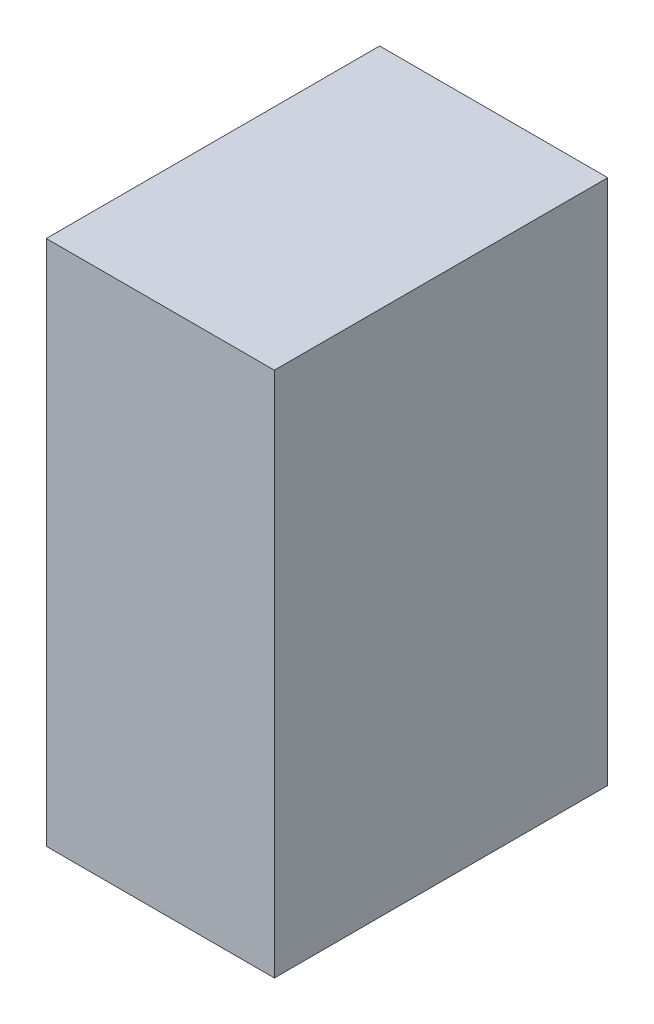
ISO-10303-21;
HEADER;
FILE_DESCRIPTION(('STEP AP214'),'2;1');
FILE_NAME('part.step','',(''),(''),'','','');
FILE_SCHEMA(('AUTOMOTIVE_DESIGN { 1 0 10303 214 1 1 1 1 }'));
ENDSEC;
DATA;
#1=APPLICATION_CONTEXT('core data for automotive mechanical design processes');
#2=APPLICATION_PROTOCOL_DEFINITION('international standard','automotive_design',2000,#1);
#3=PRODUCT_CONTEXT('',#1,'mechanical');
#4=PRODUCT('Part','Part','',(#3));
#5=PRODUCT_RELATED_PRODUCT_CATEGORY('part','',(#4));
#6=PRODUCT_DEFINITION_FORMATION('','',#4);
#7=PRODUCT_DEFINITION_CONTEXT('part definition',#1,'design');
#8=PRODUCT_DEFINITION('design','',#6,#7);
#9=PRODUCT_DEFINITION_SHAPE('','',#8);
#10=(LENGTH_UNIT() NAMED_UNIT(*) SI_UNIT(.MILLI.,.METRE.));
#11=(NAMED_UNIT(*) PLANE_ANGLE_UNIT() SI_UNIT($,.RADIAN.));
#12=(NAMED_UNIT(*) SI_UNIT($,.STERADIAN.) SOLID_ANGLE_UNIT());
#13=UNCERTAINTY_MEASURE_WITH_UNIT(LENGTH_MEASURE(1.E-05),#10,'distance_accuracy_value','');
#14=(GEOMETRIC_REPRESENTATION_CONTEXT(3) GLOBAL_UNCERTAINTY_ASSIGNED_CONTEXT((#13)) GLOBAL_UNIT_ASSIGNED_CONTEXT((#10,
#11,#12)) REPRESENTATION_CONTEXT('',''));
#15=CARTESIAN_POINT('',(0.,0.,0.));
#16=DIRECTION('',(0.,0.,1.));
#17=DIRECTION('',(1.,0.,0.));
#18=AXIS2_PLACEMENT_3D('',#15,#16,#17);
#19=CARTESIAN_POINT('',(-32.5,0.,0.));
#20=DIRECTION('',(0.,-1.,0.));
#21=DIRECTION('',(0.,0.,-1.));
#22=AXIS2_PLACEMENT_3D('',#19,#20,#21);
#23=PLANE('',#22);
#24=DIRECTION('',(1.,0.,0.));
#25=VECTOR('',#24,1.);
#26=CARTESIAN_POINT('',(-32.5,0.,0.));
#27=LINE('',#26,#25);
#28=CARTESIAN_POINT('',(-32.5,0.,0.));
#29=VERTEX_POINT('',#28);
#30=CARTESIAN_POINT('',(32.5,0.,0.));
#31=VERTEX_POINT('',#30);
#32=EDGE_CURVE('E48',#29,#31,#27,.T.);
#33=ORIENTED_EDGE('',*,*,#32,.T.);
#34=DIRECTION('',(0.,0.,-1.));
#35=VECTOR('',#34,1.);
#36=CARTESIAN_POINT('',(32.5,0.,0.));
#37=LINE('',#36,#35);
#38=CARTESIAN_POINT('',(32.5,0.,95.));
#39=VERTEX_POINT('',#38);
#40=EDGE_CURVE('E86',#39,#31,#37,.T.);
#41=ORIENTED_EDGE('',*,*,#40,.F.);
#42=DIRECTION('',(1.,0.,0.));
#43=VECTOR('',#42,1.);
#44=CARTESIAN_POINT('',(-32.5,0.,95.));
#45=LINE('',#44,#43);
#46=CARTESIAN_POINT('',(-32.5,0.,95.));
#47=VERTEX_POINT('',#46);
#48=EDGE_CURVE('E11',#47,#39,#45,.T.);
#49=ORIENTED_EDGE('',*,*,#48,.F.);
#50=DIRECTION('',(0.,0.,-1.));
#51=VECTOR('',#50,1.);
#52=CARTESIAN_POINT('',(-32.5,0.,0.));
#53=LINE('',#52,#51);
#54=EDGE_CURVE('E90',#47,#29,#53,.T.);
#55=ORIENTED_EDGE('',*,*,#54,.T.);
#56=EDGE_LOOP('',(#33,#41,#49,#55));
#57=FACE_BOUND('',#56,.T.);
#58=ADVANCED_FACE('F44',(#57),#23,.T.);
#59=CARTESIAN_POINT('',(-32.5,0.,95.));
#60=DIRECTION('',(0.,0.,1.));
#61=DIRECTION('',(0.,-1.,0.));
#62=AXIS2_PLACEMENT_3D('',#59,#60,#61);
#63=PLANE('',#62);
#64=ORIENTED_EDGE('',*,*,#48,.T.);
#65=DIRECTION('',(0.,-1.,0.));
#66=VECTOR('',#65,1.);
#67=CARTESIAN_POINT('',(32.5,0.,95.));
#68=LINE('',#67,#66);
#69=CARTESIAN_POINT('',(32.5,150.,95.));
#70=VERTEX_POINT('',#69);
#71=EDGE_CURVE('E103',#70,#39,#68,.T.);
#72=ORIENTED_EDGE('',*,*,#71,.F.);
#73=DIRECTION('',(1.,0.,0.));
#74=VECTOR('',#73,1.);
#75=CARTESIAN_POINT('',(-32.5,150.,95.));
#76=LINE('',#75,#74);
#77=CARTESIAN_POINT('',(-32.5,150.,95.));
#78=VERTEX_POINT('',#77);
#79=EDGE_CURVE('E53',#78,#70,#76,.T.);
#80=ORIENTED_EDGE('',*,*,#79,.F.);
#81=DIRECTION('',(0.,-1.,0.));
#82=VECTOR('',#81,1.);
#83=CARTESIAN_POINT('',(-32.5,0.,95.));
#84=LINE('',#83,#82);
#85=EDGE_CURVE('E93',#78,#47,#84,.T.);
#86=ORIENTED_EDGE('',*,*,#85,.T.);
#87=EDGE_LOOP('',(#64,#72,#80,#86));
#88=FACE_BOUND('',#87,.T.);
#89=ADVANCED_FACE('F129',(#88),#63,.T.);
#90=CARTESIAN_POINT('',(-32.5,150.,0.));
#91=DIRECTION('',(0.,1.,0.));
#92=DIRECTION('',(0.,0.,1.));
#93=AXIS2_PLACEMENT_3D('',#90,#91,#92);
#94=PLANE('',#93);
#95=ORIENTED_EDGE('',*,*,#79,.T.);
#96=DIRECTION('',(0.,0.,1.));
#97=VECTOR('',#96,1.);
#98=CARTESIAN_POINT('',(32.5,150.,0.));
#99=LINE('',#98,#97);
#100=CARTESIAN_POINT('',(32.5,150.,0.));
#101=VERTEX_POINT('',#100);
#102=EDGE_CURVE('E102',#101,#70,#99,.T.);
#103=ORIENTED_EDGE('',*,*,#102,.F.);
#104=DIRECTION('',(1.,0.,0.));
#105=VECTOR('',#104,1.);
#106=CARTESIAN_POINT('',(-32.5,150.,0.));
#107=LINE('',#106,#105);
#108=CARTESIAN_POINT('',(-32.5,150.,0.));
#109=VERTEX_POINT('',#108);
#110=EDGE_CURVE('E95',#109,#101,#107,.T.);
#111=ORIENTED_EDGE('',*,*,#110,.F.);
#112=DIRECTION('',(0.,0.,1.));
#113=VECTOR('',#112,1.);
#114=CARTESIAN_POINT('',(-32.5,150.,0.));
#115=LINE('',#114,#113);
#116=EDGE_CURVE('E120',#109,#78,#115,.T.);
#117=ORIENTED_EDGE('',*,*,#116,.T.);
#118=EDGE_LOOP('',(#95,#103,#111,#117));
#119=FACE_BOUND('',#118,.T.);
#120=ADVANCED_FACE('F128',(#119),#94,.T.);
#121=CARTESIAN_POINT('',(-32.5,0.,0.));
#122=DIRECTION('',(0.,0.,-1.));
#123=DIRECTION('',(-1.,0.,0.));
#124=AXIS2_PLACEMENT_3D('',#121,#122,#123);
#125=PLANE('',#124);
#126=ORIENTED_EDGE('',*,*,#110,.T.);
#127=DIRECTION('',(0.,1.,0.));
#128=VECTOR('',#127,1.);
#129=CARTESIAN_POINT('',(32.5,0.,0.));
#130=LINE('',#129,#128);
#131=EDGE_CURVE('E94',#31,#101,#130,.T.);
#132=ORIENTED_EDGE('',*,*,#131,.F.);
#133=ORIENTED_EDGE('',*,*,#32,.F.);
#134=DIRECTION('',(0.,1.,0.));
#135=VECTOR('',#134,1.);
#136=CARTESIAN_POINT('',(-32.5,0.,0.));
#137=LINE('',#136,#135);
#138=EDGE_CURVE('E113',#29,#109,#137,.T.);
#139=ORIENTED_EDGE('',*,*,#138,.T.);
#140=EDGE_LOOP('',(#126,#132,#133,#139));
#141=FACE_BOUND('',#140,.T.);
#142=ADVANCED_FACE('F96',(#141),#125,.T.);
#143=CARTESIAN_POINT('',(-32.5,0.,0.));
#144=DIRECTION('',(-1.,0.,0.));
#145=DIRECTION('',(0.,0.,1.));
#146=AXIS2_PLACEMENT_3D('',#143,#144,#145);
#147=PLANE('',#146);
#148=ORIENTED_EDGE('',*,*,#54,.F.);
#149=ORIENTED_EDGE('',*,*,#85,.F.);
#150=ORIENTED_EDGE('',*,*,#116,.F.);
#151=ORIENTED_EDGE('',*,*,#138,.F.);
#152=EDGE_LOOP('',(#148,#149,#150,#151));
#153=FACE_BOUND('',#152,.T.);
#154=ADVANCED_FACE('F131',(#153),#147,.T.);
#155=CARTESIAN_POINT('',(32.5,0.,0.));
#156=DIRECTION('',(1.,0.,0.));
#157=DIRECTION('',(0.,0.,1.));
#158=AXIS2_PLACEMENT_3D('',#155,#156,#157);
#159=PLANE('',#158);
#160=ORIENTED_EDGE('',*,*,#40,.T.);
#161=ORIENTED_EDGE('',*,*,#131,.T.);
#162=ORIENTED_EDGE('',*,*,#102,.T.);
#163=ORIENTED_EDGE('',*,*,#71,.T.);
#164=EDGE_LOOP('',(#160,#161,#162,#163));
#165=FACE_BOUND('',#164,.T.);
#166=ADVANCED_FACE('F101',(#165),#159,.T.);
#167=CLOSED_SHELL('',(#58,#89,#120,#142,#154,#166));
#168=MANIFOLD_SOLID_BREP('B2',#167);
#169=ADVANCED_BREP_SHAPE_REPRESENTATION('',(#18,#168),#14);
#170=SHAPE_DEFINITION_REPRESENTATION(#9,#169);
ENDSEC;
END-ISO-10303-21;
